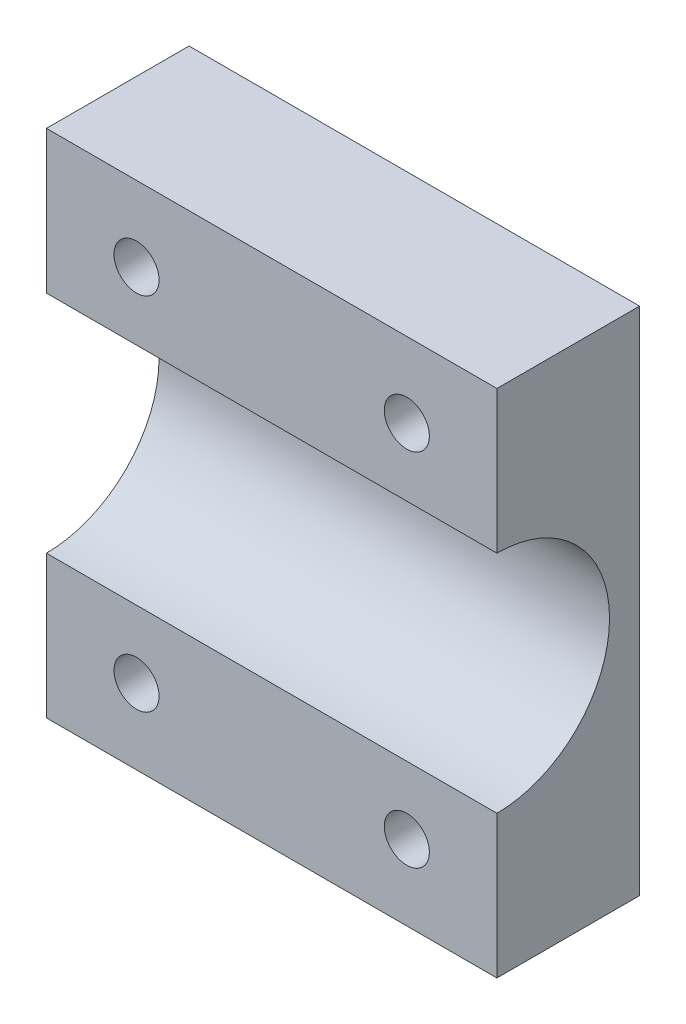
ISO-10303-21;
HEADER;
FILE_DESCRIPTION(('STEP AP214'),'2;1');
FILE_NAME('part.step','',(''),(''),'','','');
FILE_SCHEMA(('AUTOMOTIVE_DESIGN { 1 0 10303 214 1 1 1 1 }'));
ENDSEC;
DATA;
#1=APPLICATION_CONTEXT('core data for automotive mechanical design processes');
#2=APPLICATION_PROTOCOL_DEFINITION('international standard','automotive_design',2000,#1);
#3=PRODUCT_CONTEXT('',#1,'mechanical');
#4=PRODUCT('Part','Part','',(#3));
#5=PRODUCT_RELATED_PRODUCT_CATEGORY('part','',(#4));
#6=PRODUCT_DEFINITION_FORMATION('','',#4);
#7=PRODUCT_DEFINITION_CONTEXT('part definition',#1,'design');
#8=PRODUCT_DEFINITION('design','',#6,#7);
#9=PRODUCT_DEFINITION_SHAPE('','',#8);
#10=(LENGTH_UNIT() NAMED_UNIT(*) SI_UNIT(.MILLI.,.METRE.));
#11=(NAMED_UNIT(*) PLANE_ANGLE_UNIT() SI_UNIT($,.RADIAN.));
#12=(NAMED_UNIT(*) SI_UNIT($,.STERADIAN.) SOLID_ANGLE_UNIT());
#13=UNCERTAINTY_MEASURE_WITH_UNIT(LENGTH_MEASURE(1.E-05),#10,'distance_accuracy_value','');
#14=(GEOMETRIC_REPRESENTATION_CONTEXT(3) GLOBAL_UNCERTAINTY_ASSIGNED_CONTEXT((#13)) GLOBAL_UNIT_ASSIGNED_CONTEXT((#10,
#11,#12)) REPRESENTATION_CONTEXT('',''));
#15=CARTESIAN_POINT('',(0.,0.,0.));
#16=DIRECTION('',(0.,0.,1.));
#17=DIRECTION('',(1.,0.,0.));
#18=AXIS2_PLACEMENT_3D('',#15,#16,#17);
#19=CARTESIAN_POINT('',(0.,0.,9.5));
#20=DIRECTION('',(0.,0.,1.));
#21=DIRECTION('',(1.,0.,0.));
#22=AXIS2_PLACEMENT_3D('',#19,#20,#21);
#23=PLANE('',#22);
#24=DIRECTION('',(-1.,0.,0.));
#25=VECTOR('',#24,1.);
#26=CARTESIAN_POINT('',(17.038961038961,7.5,9.5));
#27=LINE('',#26,#25);
#28=CARTESIAN_POINT('',(7.03896103896103,7.5,9.5));
#29=VERTEX_POINT('',#28);
#30=CARTESIAN_POINT('',(-22.961038961039,7.5,9.5));
#31=VERTEX_POINT('',#30);
#32=EDGE_CURVE('E93',#29,#31,#27,.T.);
#33=ORIENTED_EDGE('',*,*,#32,.F.);
#34=DIRECTION('',(0.,1.,0.));
#35=VECTOR('',#34,1.);
#36=CARTESIAN_POINT('',(7.03896103896103,17.,9.5));
#37=LINE('',#36,#35);
#38=CARTESIAN_POINT('',(7.03896103896103,17.,9.5));
#39=VERTEX_POINT('',#38);
#40=EDGE_CURVE('E108',#29,#39,#37,.T.);
#41=ORIENTED_EDGE('',*,*,#40,.T.);
#42=DIRECTION('',(-1.,0.,0.));
#43=VECTOR('',#42,1.);
#44=CARTESIAN_POINT('',(-22.961038961039,17.,9.5));
#45=LINE('',#44,#43);
#46=CARTESIAN_POINT('',(-22.961038961039,17.,9.5));
#47=VERTEX_POINT('',#46);
#48=EDGE_CURVE('E56',#39,#47,#45,.T.);
#49=ORIENTED_EDGE('',*,*,#48,.T.);
#50=DIRECTION('',(0.,-1.,0.));
#51=VECTOR('',#50,1.);
#52=CARTESIAN_POINT('',(-22.961038961039,17.,9.5));
#53=LINE('',#52,#51);
#54=EDGE_CURVE('E102',#47,#31,#53,.T.);
#55=ORIENTED_EDGE('',*,*,#54,.T.);
#56=EDGE_LOOP('',(#33,#41,#49,#55));
#57=FACE_BOUND('',#56,.T.);
#58=CARTESIAN_POINT('',(-16.961038961039,12.,9.5));
#59=DIRECTION('',(0.,0.,1.));
#60=DIRECTION('',(1.,0.,0.));
#61=AXIS2_PLACEMENT_3D('',#58,#59,#60);
#62=CIRCLE('',#61,1.5);
#63=CARTESIAN_POINT('',(-15.461038961039,12.,9.5));
#64=VERTEX_POINT('',#63);
#65=EDGE_CURVE('E252',#64,#64,#62,.T.);
#66=ORIENTED_EDGE('',*,*,#65,.F.);
#67=EDGE_LOOP('',(#66));
#68=FACE_BOUND('',#67,.T.);
#69=CARTESIAN_POINT('',(1.03896103896103,12.,9.5));
#70=DIRECTION('',(0.,0.,1.));
#71=DIRECTION('',(1.,0.,0.));
#72=AXIS2_PLACEMENT_3D('',#69,#70,#71);
#73=CIRCLE('',#72,1.5);
#74=CARTESIAN_POINT('',(2.53896103896103,12.,9.5));
#75=VERTEX_POINT('',#74);
#76=EDGE_CURVE('E123',#75,#75,#73,.T.);
#77=ORIENTED_EDGE('',*,*,#76,.F.);
#78=EDGE_LOOP('',(#77));
#79=FACE_BOUND('',#78,.T.);
#80=ADVANCED_FACE('F33',(#57,#68,#79),#23,.T.);
#81=DIRECTION('',(-1.,0.,0.));
#82=VECTOR('',#81,1.);
#83=CARTESIAN_POINT('',(17.038961038961,-7.5,9.5));
#84=LINE('',#83,#82);
#85=CARTESIAN_POINT('',(-22.961038961039,-7.5,9.5));
#86=VERTEX_POINT('',#85);
#87=CARTESIAN_POINT('',(7.03896103896103,-7.5,9.5));
#88=VERTEX_POINT('',#87);
#89=EDGE_CURVE('E48',#86,#88,#84,.F.);
#90=ORIENTED_EDGE('',*,*,#89,.F.);
#91=CARTESIAN_POINT('',(-22.961038961039,-17.,9.5));
#92=VERTEX_POINT('',#91);
#93=EDGE_CURVE('E84',#86,#92,#53,.T.);
#94=ORIENTED_EDGE('',*,*,#93,.T.);
#95=DIRECTION('',(1.,0.,0.));
#96=VECTOR('',#95,1.);
#97=CARTESIAN_POINT('',(-22.961038961039,-17.,9.5));
#98=LINE('',#97,#96);
#99=CARTESIAN_POINT('',(7.03896103896103,-17.,9.5));
#100=VERTEX_POINT('',#99);
#101=EDGE_CURVE('E106',#92,#100,#98,.T.);
#102=ORIENTED_EDGE('',*,*,#101,.T.);
#103=EDGE_CURVE('E114',#100,#88,#37,.T.);
#104=ORIENTED_EDGE('',*,*,#103,.T.);
#105=EDGE_LOOP('',(#90,#94,#102,#104));
#106=FACE_BOUND('',#105,.T.);
#107=CARTESIAN_POINT('',(1.03896103896104,-12.,9.5));
#108=DIRECTION('',(0.,0.,1.));
#109=DIRECTION('',(1.,0.,0.));
#110=AXIS2_PLACEMENT_3D('',#107,#108,#109);
#111=CIRCLE('',#110,1.5);
#112=CARTESIAN_POINT('',(2.53896103896104,-12.,9.5));
#113=VERTEX_POINT('',#112);
#114=EDGE_CURVE('E257',#113,#113,#111,.T.);
#115=ORIENTED_EDGE('',*,*,#114,.F.);
#116=EDGE_LOOP('',(#115));
#117=FACE_BOUND('',#116,.T.);
#118=CARTESIAN_POINT('',(-16.961038961039,-12.,9.5));
#119=DIRECTION('',(0.,0.,1.));
#120=DIRECTION('',(1.,0.,0.));
#121=AXIS2_PLACEMENT_3D('',#118,#119,#120);
#122=CIRCLE('',#121,1.5);
#123=CARTESIAN_POINT('',(-15.461038961039,-12.,9.5));
#124=VERTEX_POINT('',#123);
#125=EDGE_CURVE('E276',#124,#124,#122,.T.);
#126=ORIENTED_EDGE('',*,*,#125,.F.);
#127=EDGE_LOOP('',(#126));
#128=FACE_BOUND('',#127,.T.);
#129=ADVANCED_FACE('F160',(#106,#117,#128),#23,.T.);
#130=CARTESIAN_POINT('',(0.,0.,0.));
#131=DIRECTION('',(0.,0.,1.));
#132=DIRECTION('',(1.,0.,0.));
#133=AXIS2_PLACEMENT_3D('',#130,#131,#132);
#134=PLANE('',#133);
#135=DIRECTION('',(0.,-1.,0.));
#136=VECTOR('',#135,1.);
#137=CARTESIAN_POINT('',(-22.961038961039,17.,0.));
#138=LINE('',#137,#136);
#139=CARTESIAN_POINT('',(-22.961038961039,17.,0.));
#140=VERTEX_POINT('',#139);
#141=CARTESIAN_POINT('',(-22.961038961039,-17.,0.));
#142=VERTEX_POINT('',#141);
#143=EDGE_CURVE('E119',#140,#142,#138,.T.);
#144=ORIENTED_EDGE('',*,*,#143,.F.);
#145=DIRECTION('',(-1.,0.,0.));
#146=VECTOR('',#145,1.);
#147=CARTESIAN_POINT('',(-22.961038961039,17.,0.));
#148=LINE('',#147,#146);
#149=CARTESIAN_POINT('',(7.03896103896103,17.,0.));
#150=VERTEX_POINT('',#149);
#151=EDGE_CURVE('E77',#150,#140,#148,.T.);
#152=ORIENTED_EDGE('',*,*,#151,.F.);
#153=DIRECTION('',(0.,1.,0.));
#154=VECTOR('',#153,1.);
#155=CARTESIAN_POINT('',(7.03896103896103,17.,0.));
#156=LINE('',#155,#154);
#157=CARTESIAN_POINT('',(7.03896103896103,-17.,0.));
#158=VERTEX_POINT('',#157);
#159=EDGE_CURVE('E125',#158,#150,#156,.T.);
#160=ORIENTED_EDGE('',*,*,#159,.F.);
#161=DIRECTION('',(1.,0.,0.));
#162=VECTOR('',#161,1.);
#163=CARTESIAN_POINT('',(-22.961038961039,-17.,0.));
#164=LINE('',#163,#162);
#165=EDGE_CURVE('E122',#142,#158,#164,.T.);
#166=ORIENTED_EDGE('',*,*,#165,.F.);
#167=EDGE_LOOP('',(#144,#152,#160,#166));
#168=FACE_BOUND('',#167,.T.);
#169=CARTESIAN_POINT('',(1.03896103896103,12.,0.));
#170=DIRECTION('',(0.,0.,1.));
#171=DIRECTION('',(1.,0.,0.));
#172=AXIS2_PLACEMENT_3D('',#169,#170,#171);
#173=CIRCLE('',#172,1.5);
#174=CARTESIAN_POINT('',(2.53896103896103,12.,0.));
#175=VERTEX_POINT('',#174);
#176=EDGE_CURVE('E111',#175,#175,#173,.T.);
#177=ORIENTED_EDGE('',*,*,#176,.T.);
#178=EDGE_LOOP('',(#177));
#179=FACE_BOUND('',#178,.T.);
#180=CARTESIAN_POINT('',(-16.961038961039,12.,0.));
#181=DIRECTION('',(0.,0.,1.));
#182=DIRECTION('',(1.,0.,0.));
#183=AXIS2_PLACEMENT_3D('',#180,#181,#182);
#184=CIRCLE('',#183,1.5);
#185=CARTESIAN_POINT('',(-15.461038961039,12.,0.));
#186=VERTEX_POINT('',#185);
#187=EDGE_CURVE('E255',#186,#186,#184,.T.);
#188=ORIENTED_EDGE('',*,*,#187,.T.);
#189=EDGE_LOOP('',(#188));
#190=FACE_BOUND('',#189,.T.);
#191=CARTESIAN_POINT('',(1.03896103896104,-12.,0.));
#192=DIRECTION('',(0.,0.,1.));
#193=DIRECTION('',(1.,0.,0.));
#194=AXIS2_PLACEMENT_3D('',#191,#192,#193);
#195=CIRCLE('',#194,1.5);
#196=CARTESIAN_POINT('',(2.53896103896104,-12.,0.));
#197=VERTEX_POINT('',#196);
#198=EDGE_CURVE('E261',#197,#197,#195,.T.);
#199=ORIENTED_EDGE('',*,*,#198,.T.);
#200=EDGE_LOOP('',(#199));
#201=FACE_BOUND('',#200,.T.);
#202=CARTESIAN_POINT('',(-16.961038961039,-12.,0.));
#203=DIRECTION('',(0.,0.,1.));
#204=DIRECTION('',(1.,0.,0.));
#205=AXIS2_PLACEMENT_3D('',#202,#203,#204);
#206=CIRCLE('',#205,1.5);
#207=CARTESIAN_POINT('',(-15.461038961039,-12.,0.));
#208=VERTEX_POINT('',#207);
#209=EDGE_CURVE('E98',#208,#208,#206,.T.);
#210=ORIENTED_EDGE('',*,*,#209,.T.);
#211=EDGE_LOOP('',(#210));
#212=FACE_BOUND('',#211,.T.);
#213=ADVANCED_FACE('F139',(#168,#179,#190,#201,#212),#134,.F.);
#214=CARTESIAN_POINT('',(-22.961038961039,17.,9.5));
#215=DIRECTION('',(1.,0.,0.));
#216=DIRECTION('',(0.,0.,-1.));
#217=AXIS2_PLACEMENT_3D('',#214,#215,#216);
#218=PLANE('',#217);
#219=ORIENTED_EDGE('',*,*,#93,.F.);
#220=CARTESIAN_POINT('',(-22.961038961039,0.,9.5));
#221=DIRECTION('',(-1.,0.,0.));
#222=DIRECTION('',(0.,0.,1.));
#223=AXIS2_PLACEMENT_3D('',#220,#221,#222);
#224=CIRCLE('',#223,7.5);
#225=EDGE_CURVE('E96',#31,#86,#224,.T.);
#226=ORIENTED_EDGE('',*,*,#225,.F.);
#227=ORIENTED_EDGE('',*,*,#54,.F.);
#228=DIRECTION('',(0.,0.,-1.));
#229=VECTOR('',#228,1.);
#230=CARTESIAN_POINT('',(-22.961038961039,17.,9.5));
#231=LINE('',#230,#229);
#232=EDGE_CURVE('E118',#47,#140,#231,.T.);
#233=ORIENTED_EDGE('',*,*,#232,.T.);
#234=ORIENTED_EDGE('',*,*,#143,.T.);
#235=DIRECTION('',(0.,0.,-1.));
#236=VECTOR('',#235,1.);
#237=CARTESIAN_POINT('',(-22.961038961039,-17.,9.5));
#238=LINE('',#237,#236);
#239=EDGE_CURVE('E41',#92,#142,#238,.T.);
#240=ORIENTED_EDGE('',*,*,#239,.F.);
#241=EDGE_LOOP('',(#219,#226,#227,#233,#234,#240));
#242=FACE_BOUND('',#241,.T.);
#243=ADVANCED_FACE('F35',(#242),#218,.F.);
#244=CARTESIAN_POINT('',(-22.961038961039,-17.,9.5));
#245=DIRECTION('',(0.,1.,0.));
#246=DIRECTION('',(-1.,0.,0.));
#247=AXIS2_PLACEMENT_3D('',#244,#245,#246);
#248=PLANE('',#247);
#249=ORIENTED_EDGE('',*,*,#165,.T.);
#250=DIRECTION('',(0.,0.,-1.));
#251=VECTOR('',#250,1.);
#252=CARTESIAN_POINT('',(7.03896103896103,-17.,9.5));
#253=LINE('',#252,#251);
#254=EDGE_CURVE('E131',#100,#158,#253,.T.);
#255=ORIENTED_EDGE('',*,*,#254,.F.);
#256=ORIENTED_EDGE('',*,*,#101,.F.);
#257=ORIENTED_EDGE('',*,*,#239,.T.);
#258=EDGE_LOOP('',(#249,#255,#256,#257));
#259=FACE_BOUND('',#258,.T.);
#260=ADVANCED_FACE('F135',(#259),#248,.F.);
#261=CARTESIAN_POINT('',(7.03896103896103,17.,9.5));
#262=DIRECTION('',(-1.,0.,0.));
#263=DIRECTION('',(0.,0.,1.));
#264=AXIS2_PLACEMENT_3D('',#261,#262,#263);
#265=PLANE('',#264);
#266=ORIENTED_EDGE('',*,*,#40,.F.);
#267=CARTESIAN_POINT('',(7.03896103896103,0.,9.5));
#268=DIRECTION('',(-1.,0.,0.));
#269=DIRECTION('',(0.,0.,1.));
#270=AXIS2_PLACEMENT_3D('',#267,#268,#269);
#271=CIRCLE('',#270,7.5);
#272=EDGE_CURVE('E11',#29,#88,#271,.T.);
#273=ORIENTED_EDGE('',*,*,#272,.T.);
#274=ORIENTED_EDGE('',*,*,#103,.F.);
#275=ORIENTED_EDGE('',*,*,#254,.T.);
#276=ORIENTED_EDGE('',*,*,#159,.T.);
#277=DIRECTION('',(0.,0.,-1.));
#278=VECTOR('',#277,1.);
#279=CARTESIAN_POINT('',(7.03896103896103,17.,9.5));
#280=LINE('',#279,#278);
#281=EDGE_CURVE('E129',#39,#150,#280,.T.);
#282=ORIENTED_EDGE('',*,*,#281,.F.);
#283=EDGE_LOOP('',(#266,#273,#274,#275,#276,#282));
#284=FACE_BOUND('',#283,.T.);
#285=ADVANCED_FACE('F144',(#284),#265,.F.);
#286=CARTESIAN_POINT('',(-22.961038961039,17.,9.5));
#287=DIRECTION('',(0.,-1.,0.));
#288=DIRECTION('',(0.,0.,-1.));
#289=AXIS2_PLACEMENT_3D('',#286,#287,#288);
#290=PLANE('',#289);
#291=ORIENTED_EDGE('',*,*,#151,.T.);
#292=ORIENTED_EDGE('',*,*,#232,.F.);
#293=ORIENTED_EDGE('',*,*,#48,.F.);
#294=ORIENTED_EDGE('',*,*,#281,.T.);
#295=EDGE_LOOP('',(#291,#292,#293,#294));
#296=FACE_BOUND('',#295,.T.);
#297=ADVANCED_FACE('F146',(#296),#290,.F.);
#298=CARTESIAN_POINT('',(1.03896103896103,12.,9.5));
#299=DIRECTION('',(0.,0.,-1.));
#300=DIRECTION('',(-1.,0.,0.));
#301=AXIS2_PLACEMENT_3D('',#298,#299,#300);
#302=CYLINDRICAL_SURFACE('',#301,1.5);
#303=ORIENTED_EDGE('',*,*,#76,.T.);
#304=EDGE_LOOP('',(#303));
#305=FACE_BOUND('',#304,.T.);
#306=ORIENTED_EDGE('',*,*,#176,.F.);
#307=EDGE_LOOP('',(#306));
#308=FACE_BOUND('',#307,.T.);
#309=ADVANCED_FACE('F148',(#305,#308),#302,.F.);
#310=CARTESIAN_POINT('',(-16.961038961039,12.,9.5));
#311=DIRECTION('',(0.,0.,-1.));
#312=DIRECTION('',(-1.,0.,0.));
#313=AXIS2_PLACEMENT_3D('',#310,#311,#312);
#314=CYLINDRICAL_SURFACE('',#313,1.5);
#315=ORIENTED_EDGE('',*,*,#65,.T.);
#316=EDGE_LOOP('',(#315));
#317=FACE_BOUND('',#316,.T.);
#318=ORIENTED_EDGE('',*,*,#187,.F.);
#319=EDGE_LOOP('',(#318));
#320=FACE_BOUND('',#319,.T.);
#321=ADVANCED_FACE('F154',(#317,#320),#314,.F.);
#322=CARTESIAN_POINT('',(1.03896103896104,-12.,9.5));
#323=DIRECTION('',(0.,0.,-1.));
#324=DIRECTION('',(-1.,0.,0.));
#325=AXIS2_PLACEMENT_3D('',#322,#323,#324);
#326=CYLINDRICAL_SURFACE('',#325,1.5);
#327=ORIENTED_EDGE('',*,*,#114,.T.);
#328=EDGE_LOOP('',(#327));
#329=FACE_BOUND('',#328,.T.);
#330=ORIENTED_EDGE('',*,*,#198,.F.);
#331=EDGE_LOOP('',(#330));
#332=FACE_BOUND('',#331,.T.);
#333=ADVANCED_FACE('F201',(#329,#332),#326,.F.);
#334=CARTESIAN_POINT('',(-16.961038961039,-12.,9.5));
#335=DIRECTION('',(0.,0.,-1.));
#336=DIRECTION('',(-1.,0.,0.));
#337=AXIS2_PLACEMENT_3D('',#334,#335,#336);
#338=CYLINDRICAL_SURFACE('',#337,1.5);
#339=ORIENTED_EDGE('',*,*,#125,.T.);
#340=EDGE_LOOP('',(#339));
#341=FACE_BOUND('',#340,.T.);
#342=ORIENTED_EDGE('',*,*,#209,.F.);
#343=EDGE_LOOP('',(#342));
#344=FACE_BOUND('',#343,.T.);
#345=ADVANCED_FACE('F191',(#341,#344),#338,.F.);
#346=CARTESIAN_POINT('',(17.038961038961,0.,9.5));
#347=DIRECTION('',(-1.,0.,0.));
#348=DIRECTION('',(0.,0.,1.));
#349=AXIS2_PLACEMENT_3D('',#346,#347,#348);
#350=CYLINDRICAL_SURFACE('',#349,7.5);
#351=ORIENTED_EDGE('',*,*,#32,.T.);
#352=ORIENTED_EDGE('',*,*,#225,.T.);
#353=ORIENTED_EDGE('',*,*,#89,.T.);
#354=ORIENTED_EDGE('',*,*,#272,.F.);
#355=EDGE_LOOP('',(#351,#352,#353,#354));
#356=FACE_BOUND('',#355,.T.);
#357=ADVANCED_FACE('F95',(#356),#350,.F.);
#358=CLOSED_SHELL('',(#80,#129,#213,#243,#260,#285,#297,#309,#321,#333,#345,#357));
#359=MANIFOLD_SOLID_BREP('B2',#358);
#360=ADVANCED_BREP_SHAPE_REPRESENTATION('',(#18,#359),#14);
#361=SHAPE_DEFINITION_REPRESENTATION(#9,#360);
ENDSEC;
END-ISO-10303-21;
